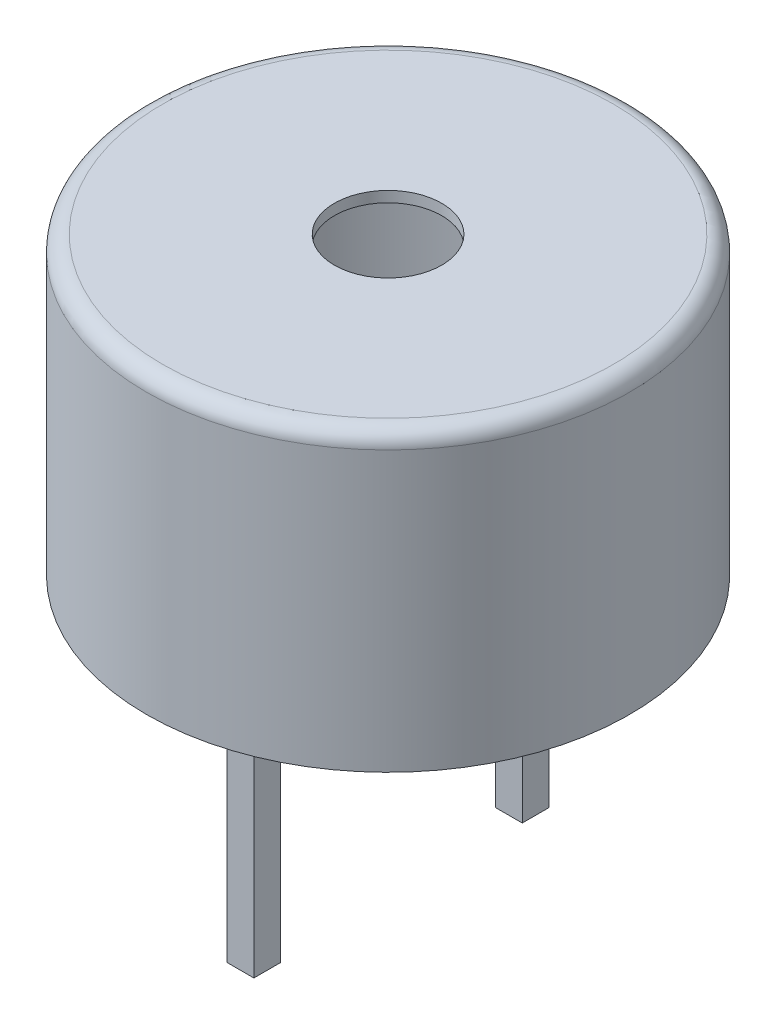
ISO-10303-21;
HEADER;
FILE_DESCRIPTION(('STEP AP214'),'2;1');
FILE_NAME('part.step','',(''),(''),'','','');
FILE_SCHEMA(('AUTOMOTIVE_DESIGN { 1 0 10303 214 1 1 1 1 }'));
ENDSEC;
DATA;
#1=APPLICATION_CONTEXT('core data for automotive mechanical design processes');
#2=APPLICATION_PROTOCOL_DEFINITION('international standard','automotive_design',2000,#1);
#3=PRODUCT_CONTEXT('',#1,'mechanical');
#4=PRODUCT('Part','Part','',(#3));
#5=PRODUCT_RELATED_PRODUCT_CATEGORY('part','',(#4));
#6=PRODUCT_DEFINITION_FORMATION('','',#4);
#7=PRODUCT_DEFINITION_CONTEXT('part definition',#1,'design');
#8=PRODUCT_DEFINITION('design','',#6,#7);
#9=PRODUCT_DEFINITION_SHAPE('','',#8);
#10=(LENGTH_UNIT() NAMED_UNIT(*) SI_UNIT(.MILLI.,.METRE.));
#11=(NAMED_UNIT(*) PLANE_ANGLE_UNIT() SI_UNIT($,.RADIAN.));
#12=(NAMED_UNIT(*) SI_UNIT($,.STERADIAN.) SOLID_ANGLE_UNIT());
#13=UNCERTAINTY_MEASURE_WITH_UNIT(LENGTH_MEASURE(1.E-05),#10,'distance_accuracy_value','');
#14=(GEOMETRIC_REPRESENTATION_CONTEXT(3) GLOBAL_UNCERTAINTY_ASSIGNED_CONTEXT((#13)) GLOBAL_UNIT_ASSIGNED_CONTEXT((#10,
#11,#12)) REPRESENTATION_CONTEXT('',''));
#15=CARTESIAN_POINT('',(0.,0.,0.));
#16=DIRECTION('',(0.,0.,1.));
#17=DIRECTION('',(1.,0.,0.));
#18=AXIS2_PLACEMENT_3D('',#15,#16,#17);
#19=CARTESIAN_POINT('',(0.,0.,0.));
#20=DIRECTION('',(0.,1.,0.));
#21=DIRECTION('',(0.,0.,1.));
#22=AXIS2_PLACEMENT_3D('',#19,#20,#21);
#23=PLANE('',#22);
#24=DIRECTION('',(0.,0.,-1.));
#25=VECTOR('',#24,1.);
#26=CARTESIAN_POINT('',(-0.25,0.,-2.75));
#27=LINE('',#26,#25);
#28=CARTESIAN_POINT('',(-0.25,0.,-2.25));
#29=VERTEX_POINT('',#28);
#30=CARTESIAN_POINT('',(-0.25,0.,-2.75));
#31=VERTEX_POINT('',#30);
#32=EDGE_CURVE('E121',#29,#31,#27,.T.);
#33=ORIENTED_EDGE('',*,*,#32,.F.);
#34=DIRECTION('',(-1.,0.,0.));
#35=VECTOR('',#34,1.);
#36=CARTESIAN_POINT('',(0.25,0.,-2.25));
#37=LINE('',#36,#35);
#38=CARTESIAN_POINT('',(0.25,0.,-2.25));
#39=VERTEX_POINT('',#38);
#40=EDGE_CURVE('E134',#39,#29,#37,.T.);
#41=ORIENTED_EDGE('',*,*,#40,.F.);
#42=DIRECTION('',(0.,0.,1.));
#43=VECTOR('',#42,1.);
#44=CARTESIAN_POINT('',(0.25,0.,-2.75));
#45=LINE('',#44,#43);
#46=CARTESIAN_POINT('',(0.25,0.,-2.75));
#47=VERTEX_POINT('',#46);
#48=EDGE_CURVE('E143',#47,#39,#45,.T.);
#49=ORIENTED_EDGE('',*,*,#48,.F.);
#50=DIRECTION('',(1.,0.,0.));
#51=VECTOR('',#50,1.);
#52=CARTESIAN_POINT('',(0.25,0.,-2.75));
#53=LINE('',#52,#51);
#54=EDGE_CURVE('E124',#31,#47,#53,.T.);
#55=ORIENTED_EDGE('',*,*,#54,.F.);
#56=EDGE_LOOP('',(#33,#41,#49,#55));
#57=FACE_BOUND('',#56,.T.);
#58=CARTESIAN_POINT('',(0.,0.,0.));
#59=DIRECTION('',(0.,1.,0.));
#60=DIRECTION('',(0.,0.,1.));
#61=AXIS2_PLACEMENT_3D('',#58,#59,#60);
#62=CIRCLE('',#61,4.5);
#63=CARTESIAN_POINT('',(0.,0.,4.5));
#64=VERTEX_POINT('',#63);
#65=EDGE_CURVE('E169',#64,#64,#62,.T.);
#66=ORIENTED_EDGE('',*,*,#65,.F.);
#67=EDGE_LOOP('',(#66));
#68=FACE_BOUND('',#67,.T.);
#69=DIRECTION('',(0.,0.,1.));
#70=VECTOR('',#69,1.);
#71=CARTESIAN_POINT('',(0.25,0.,2.75));
#72=LINE('',#71,#70);
#73=CARTESIAN_POINT('',(0.25,0.,2.25));
#74=VERTEX_POINT('',#73);
#75=CARTESIAN_POINT('',(0.25,0.,2.75));
#76=VERTEX_POINT('',#75);
#77=EDGE_CURVE('E120',#74,#76,#72,.T.);
#78=ORIENTED_EDGE('',*,*,#77,.F.);
#79=DIRECTION('',(1.,0.,0.));
#80=VECTOR('',#79,1.);
#81=CARTESIAN_POINT('',(0.25,0.,2.25));
#82=LINE('',#81,#80);
#83=CARTESIAN_POINT('',(-0.25,0.,2.25));
#84=VERTEX_POINT('',#83);
#85=EDGE_CURVE('E117',#84,#74,#82,.T.);
#86=ORIENTED_EDGE('',*,*,#85,.F.);
#87=DIRECTION('',(0.,0.,-1.));
#88=VECTOR('',#87,1.);
#89=CARTESIAN_POINT('',(-0.25,0.,2.75));
#90=LINE('',#89,#88);
#91=CARTESIAN_POINT('',(-0.25,0.,2.75));
#92=VERTEX_POINT('',#91);
#93=EDGE_CURVE('E55',#92,#84,#90,.T.);
#94=ORIENTED_EDGE('',*,*,#93,.F.);
#95=DIRECTION('',(-1.,0.,0.));
#96=VECTOR('',#95,1.);
#97=CARTESIAN_POINT('',(0.25,0.,2.75));
#98=LINE('',#97,#96);
#99=EDGE_CURVE('E50',#76,#92,#98,.T.);
#100=ORIENTED_EDGE('',*,*,#99,.F.);
#101=EDGE_LOOP('',(#78,#86,#94,#100));
#102=FACE_BOUND('',#101,.T.);
#103=ADVANCED_FACE('F35',(#57,#68,#102),#23,.F.);
#104=CARTESIAN_POINT('',(0.,5.5,0.));
#105=DIRECTION('',(0.,-1.,0.));
#106=DIRECTION('',(0.,0.,-1.));
#107=AXIS2_PLACEMENT_3D('',#104,#105,#106);
#108=CYLINDRICAL_SURFACE('',#107,3.5);
#109=CARTESIAN_POINT('',(0.,1.,0.));
#110=DIRECTION('',(0.,1.,0.));
#111=DIRECTION('',(0.,0.,1.));
#112=AXIS2_PLACEMENT_3D('',#109,#110,#111);
#113=CIRCLE('',#112,3.5);
#114=CARTESIAN_POINT('',(0.,1.,3.5));
#115=VERTEX_POINT('',#114);
#116=EDGE_CURVE('E175',#115,#115,#113,.F.);
#117=ORIENTED_EDGE('',*,*,#116,.T.);
#118=EDGE_LOOP('',(#117));
#119=FACE_BOUND('',#118,.T.);
#120=CARTESIAN_POINT('',(0.,5.3,0.));
#121=DIRECTION('',(0.,1.,0.));
#122=DIRECTION('',(0.,0.,1.));
#123=AXIS2_PLACEMENT_3D('',#120,#121,#122);
#124=CIRCLE('',#123,3.5);
#125=CARTESIAN_POINT('',(0.,5.3,3.5));
#126=VERTEX_POINT('',#125);
#127=EDGE_CURVE('E163',#126,#126,#124,.T.);
#128=ORIENTED_EDGE('',*,*,#127,.T.);
#129=EDGE_LOOP('',(#128));
#130=FACE_BOUND('',#129,.T.);
#131=ADVANCED_FACE('F194',(#119,#130),#108,.F.);
#132=CARTESIAN_POINT('',(0.,1.,0.));
#133=DIRECTION('',(0.,1.,0.));
#134=DIRECTION('',(0.,0.,1.));
#135=AXIS2_PLACEMENT_3D('',#132,#133,#134);
#136=PLANE('',#135);
#137=CARTESIAN_POINT('',(0.,1.,0.));
#138=DIRECTION('',(0.,1.,0.));
#139=DIRECTION('',(0.,0.,1.));
#140=AXIS2_PLACEMENT_3D('',#137,#138,#139);
#141=CIRCLE('',#140,2.29641631594815);
#142=CARTESIAN_POINT('',(0.,1.,2.29641631594815));
#143=VERTEX_POINT('',#142);
#144=EDGE_CURVE('E170',#143,#143,#141,.T.);
#145=ORIENTED_EDGE('',*,*,#144,.F.);
#146=EDGE_LOOP('',(#145));
#147=FACE_BOUND('',#146,.T.);
#148=ORIENTED_EDGE('',*,*,#116,.F.);
#149=EDGE_LOOP('',(#148));
#150=FACE_BOUND('',#149,.T.);
#151=ADVANCED_FACE('F200',(#147,#150),#136,.T.);
#152=CARTESIAN_POINT('',(0.,3.,0.));
#153=DIRECTION('',(0.,-1.,0.));
#154=DIRECTION('',(0.,0.,-1.));
#155=AXIS2_PLACEMENT_3D('',#152,#153,#154);
#156=CYLINDRICAL_SURFACE('',#155,2.29641631594815);
#157=CARTESIAN_POINT('',(0.,3.,0.));
#158=DIRECTION('',(0.,1.,0.));
#159=DIRECTION('',(0.,0.,1.));
#160=AXIS2_PLACEMENT_3D('',#157,#158,#159);
#161=CIRCLE('',#160,2.29641631594815);
#162=CARTESIAN_POINT('',(0.,3.,2.29641631594815));
#163=VERTEX_POINT('',#162);
#164=EDGE_CURVE('E166',#163,#163,#161,.T.);
#165=ORIENTED_EDGE('',*,*,#164,.F.);
#166=EDGE_LOOP('',(#165));
#167=FACE_BOUND('',#166,.T.);
#168=ORIENTED_EDGE('',*,*,#144,.T.);
#169=EDGE_LOOP('',(#168));
#170=FACE_BOUND('',#169,.T.);
#171=ADVANCED_FACE('F270',(#167,#170),#156,.T.);
#172=CARTESIAN_POINT('',(0.,3.,0.));
#173=DIRECTION('',(0.,1.,0.));
#174=DIRECTION('',(0.,0.,1.));
#175=AXIS2_PLACEMENT_3D('',#172,#173,#174);
#176=PLANE('',#175);
#177=ORIENTED_EDGE('',*,*,#164,.T.);
#178=EDGE_LOOP('',(#177));
#179=FACE_BOUND('',#178,.T.);
#180=ADVANCED_FACE('F266',(#179),#176,.T.);
#181=CARTESIAN_POINT('',(0.,5.3,0.));
#182=DIRECTION('',(0.,1.,0.));
#183=DIRECTION('',(0.,0.,1.));
#184=AXIS2_PLACEMENT_3D('',#181,#182,#183);
#185=PLANE('',#184);
#186=CARTESIAN_POINT('',(0.,5.3,0.));
#187=DIRECTION('',(0.,1.,0.));
#188=DIRECTION('',(0.,0.,1.));
#189=AXIS2_PLACEMENT_3D('',#186,#187,#188);
#190=CIRCLE('',#189,1.);
#191=CARTESIAN_POINT('',(0.,5.3,1.));
#192=VERTEX_POINT('',#191);
#193=EDGE_CURVE('E160',#192,#192,#190,.T.);
#194=ORIENTED_EDGE('',*,*,#193,.T.);
#195=EDGE_LOOP('',(#194));
#196=FACE_BOUND('',#195,.T.);
#197=ORIENTED_EDGE('',*,*,#127,.F.);
#198=EDGE_LOOP('',(#197));
#199=FACE_BOUND('',#198,.T.);
#200=ADVANCED_FACE('F215',(#196,#199),#185,.F.);
#201=CARTESIAN_POINT('',(0.,5.3,0.));
#202=DIRECTION('',(0.,1.,0.));
#203=DIRECTION('',(0.,0.,1.));
#204=AXIS2_PLACEMENT_3D('',#201,#202,#203);
#205=CYLINDRICAL_SURFACE('',#204,1.);
#206=ORIENTED_EDGE('',*,*,#193,.F.);
#207=EDGE_LOOP('',(#206));
#208=FACE_BOUND('',#207,.T.);
#209=CARTESIAN_POINT('',(0.,5.5,0.));
#210=DIRECTION('',(0.,1.,0.));
#211=DIRECTION('',(0.,0.,1.));
#212=AXIS2_PLACEMENT_3D('',#209,#210,#211);
#213=CIRCLE('',#212,1.);
#214=CARTESIAN_POINT('',(0.,5.5,1.));
#215=VERTEX_POINT('',#214);
#216=EDGE_CURVE('E159',#215,#215,#213,.T.);
#217=ORIENTED_EDGE('',*,*,#216,.T.);
#218=EDGE_LOOP('',(#217));
#219=FACE_BOUND('',#218,.T.);
#220=ADVANCED_FACE('F208',(#208,#219),#205,.F.);
#221=CARTESIAN_POINT('',(0.,1.,0.));
#222=DIRECTION('',(0.,-1.,0.));
#223=DIRECTION('',(0.,0.,-1.));
#224=AXIS2_PLACEMENT_3D('',#221,#222,#223);
#225=CYLINDRICAL_SURFACE('',#224,4.5);
#226=CARTESIAN_POINT('',(0.,5.2,0.));
#227=DIRECTION('',(0.,1.,0.));
#228=DIRECTION('',(0.,0.,1.));
#229=AXIS2_PLACEMENT_3D('',#226,#227,#228);
#230=CIRCLE('',#229,4.5);
#231=CARTESIAN_POINT('',(0.,5.2,4.5));
#232=VERTEX_POINT('',#231);
#233=EDGE_CURVE('E11',#232,#232,#230,.F.);
#234=ORIENTED_EDGE('',*,*,#233,.T.);
#235=EDGE_LOOP('',(#234));
#236=FACE_BOUND('',#235,.T.);
#237=ORIENTED_EDGE('',*,*,#65,.T.);
#238=EDGE_LOOP('',(#237));
#239=FACE_BOUND('',#238,.T.);
#240=ADVANCED_FACE('F206',(#236,#239),#225,.T.);
#241=CARTESIAN_POINT('',(0.,5.5,0.));
#242=DIRECTION('',(0.,1.,0.));
#243=DIRECTION('',(0.,0.,1.));
#244=AXIS2_PLACEMENT_3D('',#241,#242,#243);
#245=PLANE('',#244);
#246=CARTESIAN_POINT('',(0.,5.5,0.));
#247=DIRECTION('',(0.,1.,0.));
#248=DIRECTION('',(0.,0.,1.));
#249=AXIS2_PLACEMENT_3D('',#246,#247,#248);
#250=CIRCLE('',#249,4.2);
#251=CARTESIAN_POINT('',(0.,5.5,4.2));
#252=VERTEX_POINT('',#251);
#253=EDGE_CURVE('E43',#252,#252,#250,.T.);
#254=ORIENTED_EDGE('',*,*,#253,.T.);
#255=EDGE_LOOP('',(#254));
#256=FACE_BOUND('',#255,.T.);
#257=ORIENTED_EDGE('',*,*,#216,.F.);
#258=EDGE_LOOP('',(#257));
#259=FACE_BOUND('',#258,.T.);
#260=ADVANCED_FACE('F182',(#256,#259),#245,.T.);
#261=CARTESIAN_POINT('',(-0.25,-5.,-2.75));
#262=DIRECTION('',(1.,0.,0.));
#263=DIRECTION('',(0.,0.,-1.));
#264=AXIS2_PLACEMENT_3D('',#261,#262,#263);
#265=PLANE('',#264);
#266=ORIENTED_EDGE('',*,*,#32,.T.);
#267=DIRECTION('',(0.,1.,0.));
#268=VECTOR('',#267,1.);
#269=CARTESIAN_POINT('',(-0.25,-5.,-2.75));
#270=LINE('',#269,#268);
#271=CARTESIAN_POINT('',(-0.25,-5.,-2.75));
#272=VERTEX_POINT('',#271);
#273=EDGE_CURVE('E156',#272,#31,#270,.T.);
#274=ORIENTED_EDGE('',*,*,#273,.F.);
#275=DIRECTION('',(0.,0.,-1.));
#276=VECTOR('',#275,1.);
#277=CARTESIAN_POINT('',(-0.25,-5.,-2.75));
#278=LINE('',#277,#276);
#279=CARTESIAN_POINT('',(-0.25,-5.,-2.25));
#280=VERTEX_POINT('',#279);
#281=EDGE_CURVE('E130',#280,#272,#278,.T.);
#282=ORIENTED_EDGE('',*,*,#281,.F.);
#283=DIRECTION('',(0.,1.,0.));
#284=VECTOR('',#283,1.);
#285=CARTESIAN_POINT('',(-0.25,-5.,-2.25));
#286=LINE('',#285,#284);
#287=EDGE_CURVE('E139',#280,#29,#286,.T.);
#288=ORIENTED_EDGE('',*,*,#287,.T.);
#289=EDGE_LOOP('',(#266,#274,#282,#288));
#290=FACE_BOUND('',#289,.T.);
#291=ADVANCED_FACE('F214',(#290),#265,.F.);
#292=CARTESIAN_POINT('',(0.25,-5.,-2.75));
#293=DIRECTION('',(0.,0.,1.));
#294=DIRECTION('',(1.,0.,0.));
#295=AXIS2_PLACEMENT_3D('',#292,#293,#294);
#296=PLANE('',#295);
#297=ORIENTED_EDGE('',*,*,#54,.T.);
#298=DIRECTION('',(0.,1.,0.));
#299=VECTOR('',#298,1.);
#300=CARTESIAN_POINT('',(0.25,-5.,-2.75));
#301=LINE('',#300,#299);
#302=CARTESIAN_POINT('',(0.25,-5.,-2.75));
#303=VERTEX_POINT('',#302);
#304=EDGE_CURVE('E153',#303,#47,#301,.T.);
#305=ORIENTED_EDGE('',*,*,#304,.F.);
#306=DIRECTION('',(1.,0.,0.));
#307=VECTOR('',#306,1.);
#308=CARTESIAN_POINT('',(0.25,-5.,-2.75));
#309=LINE('',#308,#307);
#310=EDGE_CURVE('E133',#272,#303,#309,.T.);
#311=ORIENTED_EDGE('',*,*,#310,.F.);
#312=ORIENTED_EDGE('',*,*,#273,.T.);
#313=EDGE_LOOP('',(#297,#305,#311,#312));
#314=FACE_BOUND('',#313,.T.);
#315=ADVANCED_FACE('F256',(#314),#296,.F.);
#316=CARTESIAN_POINT('',(0.25,-5.,-2.75));
#317=DIRECTION('',(-1.,0.,0.));
#318=DIRECTION('',(0.,0.,1.));
#319=AXIS2_PLACEMENT_3D('',#316,#317,#318);
#320=PLANE('',#319);
#321=ORIENTED_EDGE('',*,*,#48,.T.);
#322=DIRECTION('',(0.,1.,0.));
#323=VECTOR('',#322,1.);
#324=CARTESIAN_POINT('',(0.25,-5.,-2.25));
#325=LINE('',#324,#323);
#326=CARTESIAN_POINT('',(0.25,-5.,-2.25));
#327=VERTEX_POINT('',#326);
#328=EDGE_CURVE('E150',#327,#39,#325,.T.);
#329=ORIENTED_EDGE('',*,*,#328,.F.);
#330=DIRECTION('',(0.,0.,1.));
#331=VECTOR('',#330,1.);
#332=CARTESIAN_POINT('',(0.25,-5.,-2.75));
#333=LINE('',#332,#331);
#334=EDGE_CURVE('E136',#303,#327,#333,.T.);
#335=ORIENTED_EDGE('',*,*,#334,.F.);
#336=ORIENTED_EDGE('',*,*,#304,.T.);
#337=EDGE_LOOP('',(#321,#329,#335,#336));
#338=FACE_BOUND('',#337,.T.);
#339=ADVANCED_FACE('F252',(#338),#320,.F.);
#340=CARTESIAN_POINT('',(0.25,-5.,-2.25));
#341=DIRECTION('',(0.,0.,-1.));
#342=DIRECTION('',(-1.,0.,0.));
#343=AXIS2_PLACEMENT_3D('',#340,#341,#342);
#344=PLANE('',#343);
#345=ORIENTED_EDGE('',*,*,#40,.T.);
#346=ORIENTED_EDGE('',*,*,#287,.F.);
#347=DIRECTION('',(-1.,0.,0.));
#348=VECTOR('',#347,1.);
#349=CARTESIAN_POINT('',(0.25,-5.,-2.25));
#350=LINE('',#349,#348);
#351=EDGE_CURVE('E138',#327,#280,#350,.T.);
#352=ORIENTED_EDGE('',*,*,#351,.F.);
#353=ORIENTED_EDGE('',*,*,#328,.T.);
#354=EDGE_LOOP('',(#345,#346,#352,#353));
#355=FACE_BOUND('',#354,.T.);
#356=ADVANCED_FACE('F248',(#355),#344,.F.);
#357=CARTESIAN_POINT('',(0.,-5.,0.));
#358=DIRECTION('',(0.,-1.,0.));
#359=DIRECTION('',(0.,0.,-1.));
#360=AXIS2_PLACEMENT_3D('',#357,#358,#359);
#361=PLANE('',#360);
#362=ORIENTED_EDGE('',*,*,#281,.T.);
#363=ORIENTED_EDGE('',*,*,#310,.T.);
#364=ORIENTED_EDGE('',*,*,#334,.T.);
#365=ORIENTED_EDGE('',*,*,#351,.T.);
#366=EDGE_LOOP('',(#362,#363,#364,#365));
#367=FACE_BOUND('',#366,.T.);
#368=ADVANCED_FACE('F245',(#367),#361,.T.);
#369=CARTESIAN_POINT('',(0.25,-5.,2.75));
#370=DIRECTION('',(-1.,0.,0.));
#371=DIRECTION('',(0.,0.,1.));
#372=AXIS2_PLACEMENT_3D('',#369,#370,#371);
#373=PLANE('',#372);
#374=ORIENTED_EDGE('',*,*,#77,.T.);
#375=DIRECTION('',(0.,1.,0.));
#376=VECTOR('',#375,1.);
#377=CARTESIAN_POINT('',(0.25,-5.,2.75));
#378=LINE('',#377,#376);
#379=CARTESIAN_POINT('',(0.25,-5.,2.75));
#380=VERTEX_POINT('',#379);
#381=EDGE_CURVE('E101',#380,#76,#378,.T.);
#382=ORIENTED_EDGE('',*,*,#381,.F.);
#383=DIRECTION('',(0.,0.,1.));
#384=VECTOR('',#383,1.);
#385=CARTESIAN_POINT('',(0.25,-5.,2.75));
#386=LINE('',#385,#384);
#387=CARTESIAN_POINT('',(0.25,-5.,2.25));
#388=VERTEX_POINT('',#387);
#389=EDGE_CURVE('E108',#388,#380,#386,.T.);
#390=ORIENTED_EDGE('',*,*,#389,.F.);
#391=DIRECTION('',(0.,1.,0.));
#392=VECTOR('',#391,1.);
#393=CARTESIAN_POINT('',(0.25,-5.,2.25));
#394=LINE('',#393,#392);
#395=EDGE_CURVE('E224',#388,#74,#394,.T.);
#396=ORIENTED_EDGE('',*,*,#395,.T.);
#397=EDGE_LOOP('',(#374,#382,#390,#396));
#398=FACE_BOUND('',#397,.T.);
#399=ADVANCED_FACE('F119',(#398),#373,.F.);
#400=CARTESIAN_POINT('',(0.25,-5.,2.75));
#401=DIRECTION('',(0.,0.,-1.));
#402=DIRECTION('',(-1.,0.,0.));
#403=AXIS2_PLACEMENT_3D('',#400,#401,#402);
#404=PLANE('',#403);
#405=ORIENTED_EDGE('',*,*,#99,.T.);
#406=DIRECTION('',(0.,1.,0.));
#407=VECTOR('',#406,1.);
#408=CARTESIAN_POINT('',(-0.25,-5.,2.75));
#409=LINE('',#408,#407);
#410=CARTESIAN_POINT('',(-0.25,-5.,2.75));
#411=VERTEX_POINT('',#410);
#412=EDGE_CURVE('E104',#411,#92,#409,.T.);
#413=ORIENTED_EDGE('',*,*,#412,.F.);
#414=DIRECTION('',(-1.,0.,0.));
#415=VECTOR('',#414,1.);
#416=CARTESIAN_POINT('',(0.25,-5.,2.75));
#417=LINE('',#416,#415);
#418=EDGE_CURVE('E97',#380,#411,#417,.T.);
#419=ORIENTED_EDGE('',*,*,#418,.F.);
#420=ORIENTED_EDGE('',*,*,#381,.T.);
#421=EDGE_LOOP('',(#405,#413,#419,#420));
#422=FACE_BOUND('',#421,.T.);
#423=ADVANCED_FACE('F99',(#422),#404,.F.);
#424=CARTESIAN_POINT('',(-0.25,-5.,2.75));
#425=DIRECTION('',(1.,0.,0.));
#426=DIRECTION('',(0.,0.,-1.));
#427=AXIS2_PLACEMENT_3D('',#424,#425,#426);
#428=PLANE('',#427);
#429=ORIENTED_EDGE('',*,*,#93,.T.);
#430=DIRECTION('',(0.,1.,0.));
#431=VECTOR('',#430,1.);
#432=CARTESIAN_POINT('',(-0.25,-5.,2.25));
#433=LINE('',#432,#431);
#434=CARTESIAN_POINT('',(-0.25,-5.,2.25));
#435=VERTEX_POINT('',#434);
#436=EDGE_CURVE('E126',#435,#84,#433,.T.);
#437=ORIENTED_EDGE('',*,*,#436,.F.);
#438=DIRECTION('',(0.,0.,-1.));
#439=VECTOR('',#438,1.);
#440=CARTESIAN_POINT('',(-0.25,-5.,2.75));
#441=LINE('',#440,#439);
#442=EDGE_CURVE('E107',#411,#435,#441,.T.);
#443=ORIENTED_EDGE('',*,*,#442,.F.);
#444=ORIENTED_EDGE('',*,*,#412,.T.);
#445=EDGE_LOOP('',(#429,#437,#443,#444));
#446=FACE_BOUND('',#445,.T.);
#447=ADVANCED_FACE('F233',(#446),#428,.F.);
#448=CARTESIAN_POINT('',(0.25,-5.,2.25));
#449=DIRECTION('',(0.,0.,1.));
#450=DIRECTION('',(1.,0.,0.));
#451=AXIS2_PLACEMENT_3D('',#448,#449,#450);
#452=PLANE('',#451);
#453=ORIENTED_EDGE('',*,*,#85,.T.);
#454=ORIENTED_EDGE('',*,*,#395,.F.);
#455=DIRECTION('',(1.,0.,0.));
#456=VECTOR('',#455,1.);
#457=CARTESIAN_POINT('',(0.25,-5.,2.25));
#458=LINE('',#457,#456);
#459=EDGE_CURVE('E113',#435,#388,#458,.T.);
#460=ORIENTED_EDGE('',*,*,#459,.F.);
#461=ORIENTED_EDGE('',*,*,#436,.T.);
#462=EDGE_LOOP('',(#453,#454,#460,#461));
#463=FACE_BOUND('',#462,.T.);
#464=ADVANCED_FACE('F190',(#463),#452,.F.);
#465=CARTESIAN_POINT('',(0.,-5.,0.));
#466=DIRECTION('',(0.,1.,0.));
#467=DIRECTION('',(0.,0.,1.));
#468=AXIS2_PLACEMENT_3D('',#465,#466,#467);
#469=PLANE('',#468);
#470=ORIENTED_EDGE('',*,*,#389,.T.);
#471=ORIENTED_EDGE('',*,*,#418,.T.);
#472=ORIENTED_EDGE('',*,*,#442,.T.);
#473=ORIENTED_EDGE('',*,*,#459,.T.);
#474=EDGE_LOOP('',(#470,#471,#472,#473));
#475=FACE_BOUND('',#474,.T.);
#476=ADVANCED_FACE('F111',(#475),#469,.F.);
#477=CARTESIAN_POINT('',(0.,5.2,0.));
#478=DIRECTION('',(0.,1.,0.));
#479=DIRECTION('',(0.,0.,1.));
#480=AXIS2_PLACEMENT_3D('',#477,#478,#479);
#481=TOROIDAL_SURFACE('',#480,4.2,0.3);
#482=ORIENTED_EDGE('',*,*,#233,.F.);
#483=EDGE_LOOP('',(#482));
#484=FACE_BOUND('',#483,.T.);
#485=ORIENTED_EDGE('',*,*,#253,.F.);
#486=EDGE_LOOP('',(#485));
#487=FACE_BOUND('',#486,.T.);
#488=ADVANCED_FACE('F37',(#484,#487),#481,.T.);
#489=CLOSED_SHELL('',(#103,#131,#151,#171,#180,#200,#220,#240,#260,#291,#315,#339,#356,#368,
#399,#423,#447,#464,#476,#488));
#490=MANIFOLD_SOLID_BREP('B2',#489);
#491=ADVANCED_BREP_SHAPE_REPRESENTATION('',(#18,#490),#14);
#492=SHAPE_DEFINITION_REPRESENTATION(#9,#491);
ENDSEC;
END-ISO-10303-21;
